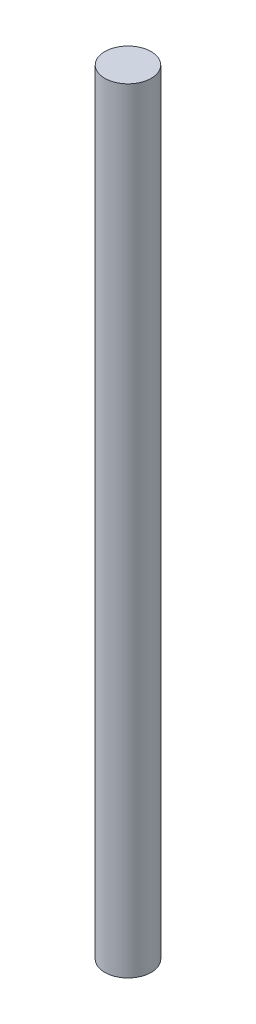
ISO-10303-21;
HEADER;
FILE_DESCRIPTION(('STEP AP214'),'2;1');
FILE_NAME('part.step','',(''),(''),'','','');
FILE_SCHEMA(('AUTOMOTIVE_DESIGN { 1 0 10303 214 1 1 1 1 }'));
ENDSEC;
DATA;
#1=APPLICATION_CONTEXT('core data for automotive mechanical design processes');
#2=APPLICATION_PROTOCOL_DEFINITION('international standard','automotive_design',2000,#1);
#3=PRODUCT_CONTEXT('',#1,'mechanical');
#4=PRODUCT('Part','Part','',(#3));
#5=PRODUCT_RELATED_PRODUCT_CATEGORY('part','',(#4));
#6=PRODUCT_DEFINITION_FORMATION('','',#4);
#7=PRODUCT_DEFINITION_CONTEXT('part definition',#1,'design');
#8=PRODUCT_DEFINITION('design','',#6,#7);
#9=PRODUCT_DEFINITION_SHAPE('','',#8);
#10=(LENGTH_UNIT() NAMED_UNIT(*) SI_UNIT(.MILLI.,.METRE.));
#11=(NAMED_UNIT(*) PLANE_ANGLE_UNIT() SI_UNIT($,.RADIAN.));
#12=(NAMED_UNIT(*) SI_UNIT($,.STERADIAN.) SOLID_ANGLE_UNIT());
#13=UNCERTAINTY_MEASURE_WITH_UNIT(LENGTH_MEASURE(1.E-05),#10,'distance_accuracy_value','');
#14=(GEOMETRIC_REPRESENTATION_CONTEXT(3) GLOBAL_UNCERTAINTY_ASSIGNED_CONTEXT((#13)) GLOBAL_UNIT_ASSIGNED_CONTEXT((#10,
#11,#12)) REPRESENTATION_CONTEXT('',''));
#15=CARTESIAN_POINT('',(0.,0.,0.));
#16=DIRECTION('',(0.,0.,1.));
#17=DIRECTION('',(1.,0.,0.));
#18=AXIS2_PLACEMENT_3D('',#15,#16,#17);
#19=CARTESIAN_POINT('',(0.,33.4,0.));
#20=DIRECTION('',(0.,-1.,0.));
#21=DIRECTION('',(0.,0.,-1.));
#22=AXIS2_PLACEMENT_3D('',#19,#20,#21);
#23=CYLINDRICAL_SURFACE('',#22,1.);
#24=CARTESIAN_POINT('',(0.,33.4,0.));
#25=DIRECTION('',(0.,1.,0.));
#26=DIRECTION('',(0.,0.,1.));
#27=AXIS2_PLACEMENT_3D('',#24,#25,#26);
#28=CIRCLE('',#27,1.);
#29=CARTESIAN_POINT('',(0.,33.4,1.));
#30=VERTEX_POINT('',#29);
#31=EDGE_CURVE('E10',#30,#30,#28,.T.);
#32=ORIENTED_EDGE('',*,*,#31,.F.);
#33=EDGE_LOOP('',(#32));
#34=FACE_BOUND('',#33,.T.);
#35=CARTESIAN_POINT('',(0.,0.,0.));
#36=DIRECTION('',(0.,1.,0.));
#37=DIRECTION('',(0.,0.,1.));
#38=AXIS2_PLACEMENT_3D('',#35,#36,#37);
#39=CIRCLE('',#38,1.);
#40=CARTESIAN_POINT('',(0.,0.,1.));
#41=VERTEX_POINT('',#40);
#42=EDGE_CURVE('E34',#41,#41,#39,.T.);
#43=ORIENTED_EDGE('',*,*,#42,.T.);
#44=EDGE_LOOP('',(#43));
#45=FACE_BOUND('',#44,.T.);
#46=ADVANCED_FACE('F31',(#34,#45),#23,.T.);
#47=CARTESIAN_POINT('',(0.,33.4,0.));
#48=DIRECTION('',(0.,1.,0.));
#49=DIRECTION('',(0.,0.,1.));
#50=AXIS2_PLACEMENT_3D('',#47,#48,#49);
#51=PLANE('',#50);
#52=ORIENTED_EDGE('',*,*,#31,.T.);
#53=EDGE_LOOP('',(#52));
#54=FACE_BOUND('',#53,.T.);
#55=ADVANCED_FACE('F46',(#54),#51,.T.);
#56=CARTESIAN_POINT('',(0.,0.,0.));
#57=DIRECTION('',(0.,1.,0.));
#58=DIRECTION('',(0.,0.,1.));
#59=AXIS2_PLACEMENT_3D('',#56,#57,#58);
#60=PLANE('',#59);
#61=ORIENTED_EDGE('',*,*,#42,.F.);
#62=EDGE_LOOP('',(#61));
#63=FACE_BOUND('',#62,.T.);
#64=ADVANCED_FACE('F44',(#63),#60,.F.);
#65=CLOSED_SHELL('',(#46,#55,#64));
#66=MANIFOLD_SOLID_BREP('B2',#65);
#67=ADVANCED_BREP_SHAPE_REPRESENTATION('',(#18,#66),#14);
#68=SHAPE_DEFINITION_REPRESENTATION(#9,#67);
ENDSEC;
END-ISO-10303-21;
